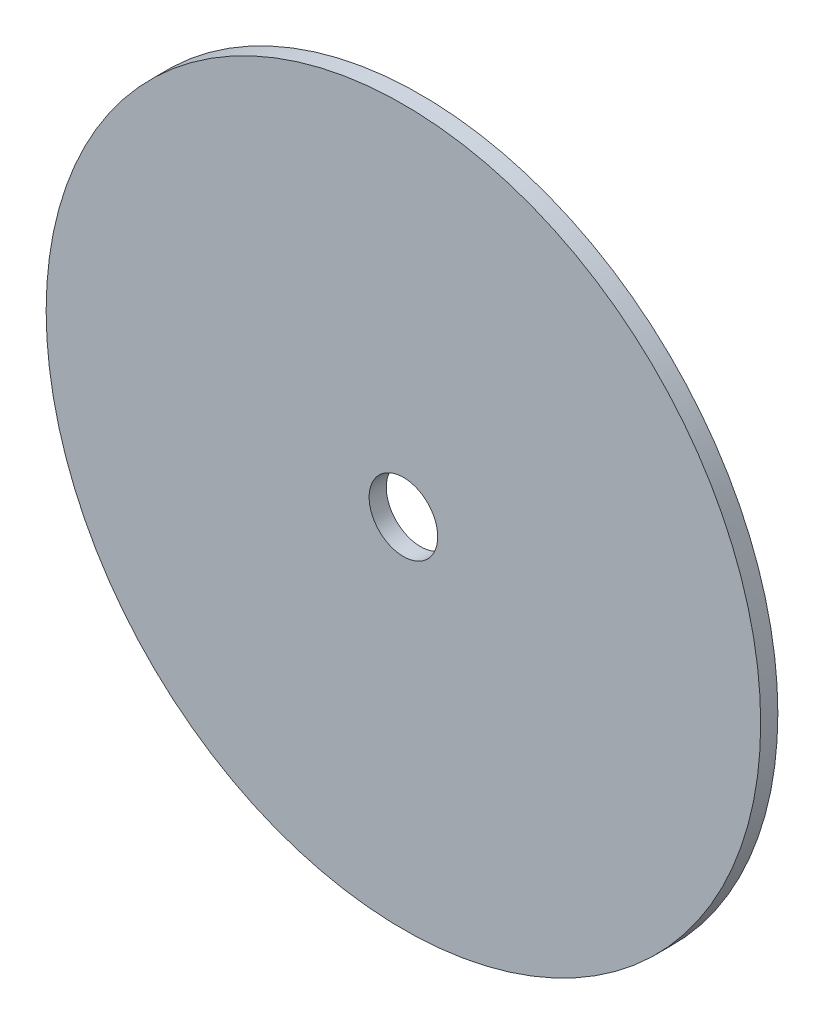
ISO-10303-21;
HEADER;
FILE_DESCRIPTION(('STEP AP214'),'2;1');
FILE_NAME('part.step','',(''),(''),'','','');
FILE_SCHEMA(('AUTOMOTIVE_DESIGN { 1 0 10303 214 1 1 1 1 }'));
ENDSEC;
DATA;
#1=APPLICATION_CONTEXT('core data for automotive mechanical design processes');
#2=APPLICATION_PROTOCOL_DEFINITION('international standard','automotive_design',2000,#1);
#3=PRODUCT_CONTEXT('',#1,'mechanical');
#4=PRODUCT('Part','Part','',(#3));
#5=PRODUCT_RELATED_PRODUCT_CATEGORY('part','',(#4));
#6=PRODUCT_DEFINITION_FORMATION('','',#4);
#7=PRODUCT_DEFINITION_CONTEXT('part definition',#1,'design');
#8=PRODUCT_DEFINITION('design','',#6,#7);
#9=PRODUCT_DEFINITION_SHAPE('','',#8);
#10=(LENGTH_UNIT() NAMED_UNIT(*) SI_UNIT(.MILLI.,.METRE.));
#11=(NAMED_UNIT(*) PLANE_ANGLE_UNIT() SI_UNIT($,.RADIAN.));
#12=(NAMED_UNIT(*) SI_UNIT($,.STERADIAN.) SOLID_ANGLE_UNIT());
#13=UNCERTAINTY_MEASURE_WITH_UNIT(LENGTH_MEASURE(1.E-05),#10,'distance_accuracy_value','');
#14=(GEOMETRIC_REPRESENTATION_CONTEXT(3) GLOBAL_UNCERTAINTY_ASSIGNED_CONTEXT((#13)) GLOBAL_UNIT_ASSIGNED_CONTEXT((#10,
#11,#12)) REPRESENTATION_CONTEXT('',''));
#15=CARTESIAN_POINT('',(0.,0.,0.));
#16=DIRECTION('',(0.,0.,1.));
#17=DIRECTION('',(1.,0.,0.));
#18=AXIS2_PLACEMENT_3D('',#15,#16,#17);
#19=CARTESIAN_POINT('',(0.,0.,3.));
#20=DIRECTION('',(0.,0.,1.));
#21=DIRECTION('',(1.,0.,0.));
#22=AXIS2_PLACEMENT_3D('',#19,#20,#21);
#23=PLANE('',#22);
#24=CARTESIAN_POINT('',(0.,0.,3.));
#25=DIRECTION('',(0.,0.,1.));
#26=DIRECTION('',(1.,0.,0.));
#27=AXIS2_PLACEMENT_3D('',#24,#25,#26);
#28=CIRCLE('',#27,62.5);
#29=CARTESIAN_POINT('',(62.5,0.,3.));
#30=VERTEX_POINT('',#29);
#31=EDGE_CURVE('E10',#30,#30,#28,.T.);
#32=ORIENTED_EDGE('',*,*,#31,.T.);
#33=EDGE_LOOP('',(#32));
#34=FACE_BOUND('',#33,.T.);
#35=CARTESIAN_POINT('',(0.,0.,3.));
#36=DIRECTION('',(0.,0.,1.));
#37=DIRECTION('',(1.,0.,0.));
#38=AXIS2_PLACEMENT_3D('',#35,#36,#37);
#39=CIRCLE('',#38,6.);
#40=CARTESIAN_POINT('',(6.,0.,3.));
#41=VERTEX_POINT('',#40);
#42=EDGE_CURVE('E44',#41,#41,#39,.T.);
#43=ORIENTED_EDGE('',*,*,#42,.F.);
#44=EDGE_LOOP('',(#43));
#45=FACE_BOUND('',#44,.T.);
#46=ADVANCED_FACE('F33',(#34,#45),#23,.T.);
#47=CARTESIAN_POINT('',(0.,0.,0.));
#48=DIRECTION('',(0.,0.,1.));
#49=DIRECTION('',(1.,0.,0.));
#50=AXIS2_PLACEMENT_3D('',#47,#48,#49);
#51=PLANE('',#50);
#52=CARTESIAN_POINT('',(0.,0.,0.));
#53=DIRECTION('',(0.,0.,1.));
#54=DIRECTION('',(1.,0.,0.));
#55=AXIS2_PLACEMENT_3D('',#52,#53,#54);
#56=CIRCLE('',#55,62.5);
#57=CARTESIAN_POINT('',(62.5,0.,0.));
#58=VERTEX_POINT('',#57);
#59=EDGE_CURVE('E37',#58,#58,#56,.T.);
#60=ORIENTED_EDGE('',*,*,#59,.F.);
#61=EDGE_LOOP('',(#60));
#62=FACE_BOUND('',#61,.T.);
#63=CARTESIAN_POINT('',(0.,0.,0.));
#64=DIRECTION('',(0.,0.,1.));
#65=DIRECTION('',(1.,0.,0.));
#66=AXIS2_PLACEMENT_3D('',#63,#64,#65);
#67=CIRCLE('',#66,6.);
#68=CARTESIAN_POINT('',(6.,0.,0.));
#69=VERTEX_POINT('',#68);
#70=EDGE_CURVE('E46',#69,#69,#67,.T.);
#71=ORIENTED_EDGE('',*,*,#70,.T.);
#72=EDGE_LOOP('',(#71));
#73=FACE_BOUND('',#72,.T.);
#74=ADVANCED_FACE('F56',(#62,#73),#51,.F.);
#75=CARTESIAN_POINT('',(0.,0.,3.));
#76=DIRECTION('',(0.,0.,-1.));
#77=DIRECTION('',(-1.,0.,0.));
#78=AXIS2_PLACEMENT_3D('',#75,#76,#77);
#79=CYLINDRICAL_SURFACE('',#78,62.5);
#80=ORIENTED_EDGE('',*,*,#31,.F.);
#81=EDGE_LOOP('',(#80));
#82=FACE_BOUND('',#81,.T.);
#83=ORIENTED_EDGE('',*,*,#59,.T.);
#84=EDGE_LOOP('',(#83));
#85=FACE_BOUND('',#84,.T.);
#86=ADVANCED_FACE('F35',(#82,#85),#79,.T.);
#87=CARTESIAN_POINT('',(0.,0.,3.));
#88=DIRECTION('',(0.,0.,-1.));
#89=DIRECTION('',(-1.,0.,0.));
#90=AXIS2_PLACEMENT_3D('',#87,#88,#89);
#91=CYLINDRICAL_SURFACE('',#90,6.);
#92=ORIENTED_EDGE('',*,*,#42,.T.);
#93=EDGE_LOOP('',(#92));
#94=FACE_BOUND('',#93,.T.);
#95=ORIENTED_EDGE('',*,*,#70,.F.);
#96=EDGE_LOOP('',(#95));
#97=FACE_BOUND('',#96,.T.);
#98=ADVANCED_FACE('F52',(#94,#97),#91,.F.);
#99=CLOSED_SHELL('',(#46,#74,#86,#98));
#100=MANIFOLD_SOLID_BREP('B2',#99);
#101=ADVANCED_BREP_SHAPE_REPRESENTATION('',(#18,#100),#14);
#102=SHAPE_DEFINITION_REPRESENTATION(#9,#101);
ENDSEC;
END-ISO-10303-21;
